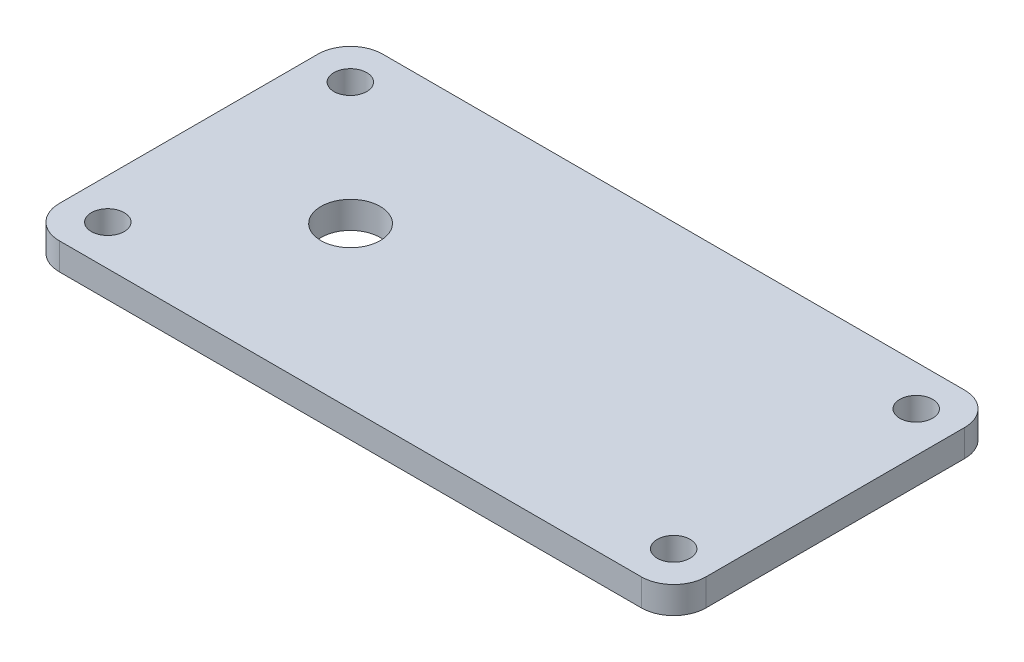
ISO-10303-21;
HEADER;
FILE_DESCRIPTION(('STEP AP214'),'2;1');
FILE_NAME('part.step','',(''),(''),'','','');
FILE_SCHEMA(('AUTOMOTIVE_DESIGN { 1 0 10303 214 1 1 1 1 }'));
ENDSEC;
DATA;
#1=APPLICATION_CONTEXT('core data for automotive mechanical design processes');
#2=APPLICATION_PROTOCOL_DEFINITION('international standard','automotive_design',2000,#1);
#3=PRODUCT_CONTEXT('',#1,'mechanical');
#4=PRODUCT('Part','Part','',(#3));
#5=PRODUCT_RELATED_PRODUCT_CATEGORY('part','',(#4));
#6=PRODUCT_DEFINITION_FORMATION('','',#4);
#7=PRODUCT_DEFINITION_CONTEXT('part definition',#1,'design');
#8=PRODUCT_DEFINITION('design','',#6,#7);
#9=PRODUCT_DEFINITION_SHAPE('','',#8);
#10=(LENGTH_UNIT() NAMED_UNIT(*) SI_UNIT(.MILLI.,.METRE.));
#11=(NAMED_UNIT(*) PLANE_ANGLE_UNIT() SI_UNIT($,.RADIAN.));
#12=(NAMED_UNIT(*) SI_UNIT($,.STERADIAN.) SOLID_ANGLE_UNIT());
#13=UNCERTAINTY_MEASURE_WITH_UNIT(LENGTH_MEASURE(1.E-05),#10,'distance_accuracy_value','');
#14=(GEOMETRIC_REPRESENTATION_CONTEXT(3) GLOBAL_UNCERTAINTY_ASSIGNED_CONTEXT((#13)) GLOBAL_UNIT_ASSIGNED_CONTEXT((#10,
#11,#12)) REPRESENTATION_CONTEXT('',''));
#15=CARTESIAN_POINT('',(0.,0.,0.));
#16=DIRECTION('',(0.,0.,1.));
#17=DIRECTION('',(1.,0.,0.));
#18=AXIS2_PLACEMENT_3D('',#15,#16,#17);
#19=CARTESIAN_POINT('',(60.,5.,-30.));
#20=DIRECTION('',(-1.,0.,0.));
#21=DIRECTION('',(0.,0.,1.));
#22=AXIS2_PLACEMENT_3D('',#19,#20,#21);
#23=PLANE('',#22);
#24=DIRECTION('',(0.,0.,-1.));
#25=VECTOR('',#24,1.);
#26=CARTESIAN_POINT('',(60.,0.,-30.));
#27=LINE('',#26,#25);
#28=CARTESIAN_POINT('',(60.,0.,24.));
#29=VERTEX_POINT('',#28);
#30=CARTESIAN_POINT('',(60.,0.,-24.));
#31=VERTEX_POINT('',#30);
#32=EDGE_CURVE('E133',#29,#31,#27,.T.);
#33=ORIENTED_EDGE('',*,*,#32,.T.);
#34=DIRECTION('',(0.,-1.,0.));
#35=VECTOR('',#34,1.);
#36=CARTESIAN_POINT('',(60.,5.,-24.));
#37=LINE('',#36,#35);
#38=CARTESIAN_POINT('',(60.,5.,-24.));
#39=VERTEX_POINT('',#38);
#40=EDGE_CURVE('E160',#31,#39,#37,.F.);
#41=ORIENTED_EDGE('',*,*,#40,.T.);
#42=DIRECTION('',(0.,0.,-1.));
#43=VECTOR('',#42,1.);
#44=CARTESIAN_POINT('',(60.,5.,-30.));
#45=LINE('',#44,#43);
#46=CARTESIAN_POINT('',(60.,5.,24.));
#47=VERTEX_POINT('',#46);
#48=EDGE_CURVE('E132',#47,#39,#45,.T.);
#49=ORIENTED_EDGE('',*,*,#48,.F.);
#50=DIRECTION('',(0.,-1.,0.));
#51=VECTOR('',#50,1.);
#52=CARTESIAN_POINT('',(60.,5.,24.));
#53=LINE('',#52,#51);
#54=EDGE_CURVE('E152',#47,#29,#53,.T.);
#55=ORIENTED_EDGE('',*,*,#54,.T.);
#56=EDGE_LOOP('',(#33,#41,#49,#55));
#57=FACE_BOUND('',#56,.T.);
#58=ADVANCED_FACE('F39',(#57),#23,.F.);
#59=CARTESIAN_POINT('',(-60.,5.,-30.));
#60=DIRECTION('',(0.,0.,1.));
#61=DIRECTION('',(1.,0.,0.));
#62=AXIS2_PLACEMENT_3D('',#59,#60,#61);
#63=PLANE('',#62);
#64=DIRECTION('',(-1.,0.,0.));
#65=VECTOR('',#64,1.);
#66=CARTESIAN_POINT('',(-60.,0.,-30.));
#67=LINE('',#66,#65);
#68=CARTESIAN_POINT('',(54.,0.,-30.));
#69=VERTEX_POINT('',#68);
#70=CARTESIAN_POINT('',(-54.,0.,-30.));
#71=VERTEX_POINT('',#70);
#72=EDGE_CURVE('E128',#69,#71,#67,.T.);
#73=ORIENTED_EDGE('',*,*,#72,.T.);
#74=DIRECTION('',(0.,-1.,0.));
#75=VECTOR('',#74,1.);
#76=CARTESIAN_POINT('',(-54.,5.,-30.));
#77=LINE('',#76,#75);
#78=CARTESIAN_POINT('',(-54.,5.,-30.));
#79=VERTEX_POINT('',#78);
#80=EDGE_CURVE('E108',#71,#79,#77,.F.);
#81=ORIENTED_EDGE('',*,*,#80,.T.);
#82=DIRECTION('',(-1.,0.,0.));
#83=VECTOR('',#82,1.);
#84=CARTESIAN_POINT('',(-60.,5.,-30.));
#85=LINE('',#84,#83);
#86=CARTESIAN_POINT('',(54.,5.,-30.));
#87=VERTEX_POINT('',#86);
#88=EDGE_CURVE('E174',#87,#79,#85,.T.);
#89=ORIENTED_EDGE('',*,*,#88,.F.);
#90=DIRECTION('',(0.,-1.,0.));
#91=VECTOR('',#90,1.);
#92=CARTESIAN_POINT('',(54.,5.,-30.));
#93=LINE('',#92,#91);
#94=EDGE_CURVE('E111',#87,#69,#93,.T.);
#95=ORIENTED_EDGE('',*,*,#94,.T.);
#96=EDGE_LOOP('',(#73,#81,#89,#95));
#97=FACE_BOUND('',#96,.T.);
#98=ADVANCED_FACE('F237',(#97),#63,.F.);
#99=CARTESIAN_POINT('',(-60.,5.,-30.));
#100=DIRECTION('',(1.,0.,0.));
#101=DIRECTION('',(0.,0.,-1.));
#102=AXIS2_PLACEMENT_3D('',#99,#100,#101);
#103=PLANE('',#102);
#104=DIRECTION('',(0.,0.,1.));
#105=VECTOR('',#104,1.);
#106=CARTESIAN_POINT('',(-60.,5.,-30.));
#107=LINE('',#106,#105);
#108=CARTESIAN_POINT('',(-60.,5.,-24.));
#109=VERTEX_POINT('',#108);
#110=CARTESIAN_POINT('',(-60.,5.,24.));
#111=VERTEX_POINT('',#110);
#112=EDGE_CURVE('E123',#109,#111,#107,.T.);
#113=ORIENTED_EDGE('',*,*,#112,.F.);
#114=DIRECTION('',(0.,-1.,0.));
#115=VECTOR('',#114,1.);
#116=CARTESIAN_POINT('',(-60.,5.,-24.));
#117=LINE('',#116,#115);
#118=CARTESIAN_POINT('',(-60.,0.,-24.));
#119=VERTEX_POINT('',#118);
#120=EDGE_CURVE('E107',#109,#119,#117,.T.);
#121=ORIENTED_EDGE('',*,*,#120,.T.);
#122=DIRECTION('',(0.,0.,1.));
#123=VECTOR('',#122,1.);
#124=CARTESIAN_POINT('',(-60.,0.,-30.));
#125=LINE('',#124,#123);
#126=CARTESIAN_POINT('',(-60.,0.,24.));
#127=VERTEX_POINT('',#126);
#128=EDGE_CURVE('E122',#119,#127,#125,.T.);
#129=ORIENTED_EDGE('',*,*,#128,.T.);
#130=DIRECTION('',(0.,-1.,0.));
#131=VECTOR('',#130,1.);
#132=CARTESIAN_POINT('',(-60.,5.,24.));
#133=LINE('',#132,#131);
#134=EDGE_CURVE('E121',#127,#111,#133,.F.);
#135=ORIENTED_EDGE('',*,*,#134,.T.);
#136=EDGE_LOOP('',(#113,#121,#129,#135));
#137=FACE_BOUND('',#136,.T.);
#138=ADVANCED_FACE('F120',(#137),#103,.F.);
#139=CARTESIAN_POINT('',(-60.,5.,30.));
#140=DIRECTION('',(0.,0.,-1.));
#141=DIRECTION('',(-1.,0.,0.));
#142=AXIS2_PLACEMENT_3D('',#139,#140,#141);
#143=PLANE('',#142);
#144=DIRECTION('',(1.,0.,0.));
#145=VECTOR('',#144,1.);
#146=CARTESIAN_POINT('',(-60.,0.,30.));
#147=LINE('',#146,#145);
#148=CARTESIAN_POINT('',(-54.,0.,30.));
#149=VERTEX_POINT('',#148);
#150=CARTESIAN_POINT('',(54.,0.,30.));
#151=VERTEX_POINT('',#150);
#152=EDGE_CURVE('E129',#149,#151,#147,.T.);
#153=ORIENTED_EDGE('',*,*,#152,.T.);
#154=DIRECTION('',(0.,-1.,0.));
#155=VECTOR('',#154,1.);
#156=CARTESIAN_POINT('',(54.,5.,30.));
#157=LINE('',#156,#155);
#158=CARTESIAN_POINT('',(54.,5.,30.));
#159=VERTEX_POINT('',#158);
#160=EDGE_CURVE('E11',#151,#159,#157,.F.);
#161=ORIENTED_EDGE('',*,*,#160,.T.);
#162=DIRECTION('',(1.,0.,0.));
#163=VECTOR('',#162,1.);
#164=CARTESIAN_POINT('',(-60.,5.,30.));
#165=LINE('',#164,#163);
#166=CARTESIAN_POINT('',(-54.,5.,30.));
#167=VERTEX_POINT('',#166);
#168=EDGE_CURVE('E138',#167,#159,#165,.T.);
#169=ORIENTED_EDGE('',*,*,#168,.F.);
#170=DIRECTION('',(0.,-1.,0.));
#171=VECTOR('',#170,1.);
#172=CARTESIAN_POINT('',(-54.,5.,30.));
#173=LINE('',#172,#171);
#174=EDGE_CURVE('E50',#167,#149,#173,.T.);
#175=ORIENTED_EDGE('',*,*,#174,.T.);
#176=EDGE_LOOP('',(#153,#161,#169,#175));
#177=FACE_BOUND('',#176,.T.);
#178=ADVANCED_FACE('F159',(#177),#143,.F.);
#179=CARTESIAN_POINT('',(0.,5.,0.));
#180=DIRECTION('',(0.,1.,0.));
#181=DIRECTION('',(0.,0.,1.));
#182=AXIS2_PLACEMENT_3D('',#179,#180,#181);
#183=PLANE('',#182);
#184=CARTESIAN_POINT('',(-29.7498226901039,5.,0.203269064290601));
#185=DIRECTION('',(0.,1.,0.));
#186=DIRECTION('',(0.,0.,1.));
#187=AXIS2_PLACEMENT_3D('',#184,#185,#186);
#188=CIRCLE('',#187,5.5);
#189=CARTESIAN_POINT('',(-29.7498226901039,5.,5.7032690642906));
#190=VERTEX_POINT('',#189);
#191=EDGE_CURVE('E210',#190,#190,#188,.T.);
#192=ORIENTED_EDGE('',*,*,#191,.F.);
#193=EDGE_LOOP('',(#192));
#194=FACE_BOUND('',#193,.T.);
#195=CARTESIAN_POINT('',(52.5,5.,-22.5));
#196=DIRECTION('',(0.,-1.,0.));
#197=DIRECTION('',(0.,0.,1.));
#198=AXIS2_PLACEMENT_3D('',#195,#196,#197);
#199=CIRCLE('',#198,3.05);
#200=CARTESIAN_POINT('',(52.5,5.,-19.45));
#201=VERTEX_POINT('',#200);
#202=EDGE_CURVE('E203',#201,#201,#199,.T.);
#203=ORIENTED_EDGE('',*,*,#202,.T.);
#204=EDGE_LOOP('',(#203));
#205=FACE_BOUND('',#204,.T.);
#206=CARTESIAN_POINT('',(52.5,5.,22.5));
#207=DIRECTION('',(0.,1.,0.));
#208=DIRECTION('',(0.,0.,-1.));
#209=AXIS2_PLACEMENT_3D('',#206,#207,#208);
#210=CIRCLE('',#209,3.05);
#211=CARTESIAN_POINT('',(52.5,5.,19.45));
#212=VERTEX_POINT('',#211);
#213=EDGE_CURVE('E191',#212,#212,#210,.T.);
#214=ORIENTED_EDGE('',*,*,#213,.F.);
#215=EDGE_LOOP('',(#214));
#216=FACE_BOUND('',#215,.T.);
#217=CARTESIAN_POINT('',(-52.5,5.,22.5));
#218=DIRECTION('',(0.,-1.,0.));
#219=DIRECTION('',(0.,0.,-1.));
#220=AXIS2_PLACEMENT_3D('',#217,#218,#219);
#221=CIRCLE('',#220,3.05);
#222=CARTESIAN_POINT('',(-52.5,5.,19.45));
#223=VERTEX_POINT('',#222);
#224=EDGE_CURVE('E188',#223,#223,#221,.T.);
#225=ORIENTED_EDGE('',*,*,#224,.T.);
#226=EDGE_LOOP('',(#225));
#227=FACE_BOUND('',#226,.T.);
#228=CARTESIAN_POINT('',(-52.5,5.,-22.5));
#229=DIRECTION('',(0.,1.,0.));
#230=DIRECTION('',(0.,0.,1.));
#231=AXIS2_PLACEMENT_3D('',#228,#229,#230);
#232=CIRCLE('',#231,3.05);
#233=CARTESIAN_POINT('',(-52.5,5.,-19.45));
#234=VERTEX_POINT('',#233);
#235=EDGE_CURVE('E178',#234,#234,#232,.T.);
#236=ORIENTED_EDGE('',*,*,#235,.F.);
#237=EDGE_LOOP('',(#236));
#238=FACE_BOUND('',#237,.T.);
#239=ORIENTED_EDGE('',*,*,#88,.T.);
#240=CARTESIAN_POINT('',(-54.,5.,-24.));
#241=DIRECTION('',(0.,1.,0.));
#242=DIRECTION('',(0.,0.,1.));
#243=AXIS2_PLACEMENT_3D('',#240,#241,#242);
#244=CIRCLE('',#243,6.);
#245=EDGE_CURVE('E155',#79,#109,#244,.T.);
#246=ORIENTED_EDGE('',*,*,#245,.T.);
#247=ORIENTED_EDGE('',*,*,#112,.T.);
#248=CARTESIAN_POINT('',(-54.,5.,24.));
#249=DIRECTION('',(0.,1.,0.));
#250=DIRECTION('',(0.,0.,1.));
#251=AXIS2_PLACEMENT_3D('',#248,#249,#250);
#252=CIRCLE('',#251,6.);
#253=EDGE_CURVE('E56',#111,#167,#252,.T.);
#254=ORIENTED_EDGE('',*,*,#253,.T.);
#255=ORIENTED_EDGE('',*,*,#168,.T.);
#256=CARTESIAN_POINT('',(54.,5.,24.));
#257=DIRECTION('',(0.,1.,0.));
#258=DIRECTION('',(0.,0.,1.));
#259=AXIS2_PLACEMENT_3D('',#256,#257,#258);
#260=CIRCLE('',#259,6.);
#261=EDGE_CURVE('E146',#159,#47,#260,.T.);
#262=ORIENTED_EDGE('',*,*,#261,.T.);
#263=ORIENTED_EDGE('',*,*,#48,.T.);
#264=CARTESIAN_POINT('',(54.,5.,-24.));
#265=DIRECTION('',(0.,1.,0.));
#266=DIRECTION('',(0.,0.,1.));
#267=AXIS2_PLACEMENT_3D('',#264,#265,#266);
#268=CIRCLE('',#267,6.);
#269=EDGE_CURVE('E147',#39,#87,#268,.T.);
#270=ORIENTED_EDGE('',*,*,#269,.T.);
#271=EDGE_LOOP('',(#239,#246,#247,#254,#255,#262,#263,#270));
#272=FACE_BOUND('',#271,.T.);
#273=ADVANCED_FACE('F225',(#194,#205,#216,#227,#238,#272),#183,.T.);
#274=CARTESIAN_POINT('',(0.,0.,0.));
#275=DIRECTION('',(0.,1.,0.));
#276=DIRECTION('',(0.,0.,1.));
#277=AXIS2_PLACEMENT_3D('',#274,#275,#276);
#278=PLANE('',#277);
#279=CARTESIAN_POINT('',(-29.7498226901039,0.,0.203269064290601));
#280=DIRECTION('',(0.,1.,0.));
#281=DIRECTION('',(0.,0.,1.));
#282=AXIS2_PLACEMENT_3D('',#279,#280,#281);
#283=CIRCLE('',#282,5.5);
#284=CARTESIAN_POINT('',(-29.7498226901039,0.,5.7032690642906));
#285=VERTEX_POINT('',#284);
#286=EDGE_CURVE('E204',#285,#285,#283,.T.);
#287=ORIENTED_EDGE('',*,*,#286,.T.);
#288=EDGE_LOOP('',(#287));
#289=FACE_BOUND('',#288,.T.);
#290=CARTESIAN_POINT('',(52.5,0.,-22.5));
#291=DIRECTION('',(0.,-1.,0.));
#292=DIRECTION('',(0.,0.,1.));
#293=AXIS2_PLACEMENT_3D('',#290,#291,#292);
#294=CIRCLE('',#293,3.05);
#295=CARTESIAN_POINT('',(52.5,0.,-19.45));
#296=VERTEX_POINT('',#295);
#297=EDGE_CURVE('E196',#296,#296,#294,.T.);
#298=ORIENTED_EDGE('',*,*,#297,.F.);
#299=EDGE_LOOP('',(#298));
#300=FACE_BOUND('',#299,.T.);
#301=CARTESIAN_POINT('',(52.5,0.,22.5));
#302=DIRECTION('',(0.,1.,0.));
#303=DIRECTION('',(0.,0.,-1.));
#304=AXIS2_PLACEMENT_3D('',#301,#302,#303);
#305=CIRCLE('',#304,3.05);
#306=CARTESIAN_POINT('',(52.5,0.,19.45));
#307=VERTEX_POINT('',#306);
#308=EDGE_CURVE('E195',#307,#307,#305,.T.);
#309=ORIENTED_EDGE('',*,*,#308,.T.);
#310=EDGE_LOOP('',(#309));
#311=FACE_BOUND('',#310,.T.);
#312=CARTESIAN_POINT('',(-52.5,0.,22.5));
#313=DIRECTION('',(0.,-1.,0.));
#314=DIRECTION('',(0.,0.,-1.));
#315=AXIS2_PLACEMENT_3D('',#312,#313,#314);
#316=CIRCLE('',#315,3.05);
#317=CARTESIAN_POINT('',(-52.5,0.,19.45));
#318=VERTEX_POINT('',#317);
#319=EDGE_CURVE('E187',#318,#318,#316,.T.);
#320=ORIENTED_EDGE('',*,*,#319,.F.);
#321=EDGE_LOOP('',(#320));
#322=FACE_BOUND('',#321,.T.);
#323=CARTESIAN_POINT('',(-52.5,0.,-22.5));
#324=DIRECTION('',(0.,1.,0.));
#325=DIRECTION('',(0.,0.,1.));
#326=AXIS2_PLACEMENT_3D('',#323,#324,#325);
#327=CIRCLE('',#326,3.05);
#328=CARTESIAN_POINT('',(-52.5,0.,-19.45));
#329=VERTEX_POINT('',#328);
#330=EDGE_CURVE('E185',#329,#329,#327,.T.);
#331=ORIENTED_EDGE('',*,*,#330,.T.);
#332=EDGE_LOOP('',(#331));
#333=FACE_BOUND('',#332,.T.);
#334=ORIENTED_EDGE('',*,*,#128,.F.);
#335=CARTESIAN_POINT('',(-54.,0.,-24.));
#336=DIRECTION('',(0.,1.,0.));
#337=DIRECTION('',(0.,0.,1.));
#338=AXIS2_PLACEMENT_3D('',#335,#336,#337);
#339=CIRCLE('',#338,6.);
#340=EDGE_CURVE('E102',#119,#71,#339,.F.);
#341=ORIENTED_EDGE('',*,*,#340,.T.);
#342=ORIENTED_EDGE('',*,*,#72,.F.);
#343=CARTESIAN_POINT('',(54.,0.,-24.));
#344=DIRECTION('',(0.,1.,0.));
#345=DIRECTION('',(0.,0.,1.));
#346=AXIS2_PLACEMENT_3D('',#343,#344,#345);
#347=CIRCLE('',#346,6.);
#348=EDGE_CURVE('E113',#69,#31,#347,.F.);
#349=ORIENTED_EDGE('',*,*,#348,.T.);
#350=ORIENTED_EDGE('',*,*,#32,.F.);
#351=CARTESIAN_POINT('',(54.,0.,24.));
#352=DIRECTION('',(0.,1.,0.));
#353=DIRECTION('',(0.,0.,1.));
#354=AXIS2_PLACEMENT_3D('',#351,#352,#353);
#355=CIRCLE('',#354,6.);
#356=EDGE_CURVE('E143',#29,#151,#355,.F.);
#357=ORIENTED_EDGE('',*,*,#356,.T.);
#358=ORIENTED_EDGE('',*,*,#152,.F.);
#359=CARTESIAN_POINT('',(-54.,0.,24.));
#360=DIRECTION('',(0.,1.,0.));
#361=DIRECTION('',(0.,0.,1.));
#362=AXIS2_PLACEMENT_3D('',#359,#360,#361);
#363=CIRCLE('',#362,6.);
#364=EDGE_CURVE('E124',#149,#127,#363,.F.);
#365=ORIENTED_EDGE('',*,*,#364,.T.);
#366=EDGE_LOOP('',(#334,#341,#342,#349,#350,#357,#358,#365));
#367=FACE_BOUND('',#366,.T.);
#368=ADVANCED_FACE('F130',(#289,#300,#311,#322,#333,#367),#278,.F.);
#369=CARTESIAN_POINT('',(-52.5,0.,-22.5));
#370=DIRECTION('',(0.,1.,0.));
#371=DIRECTION('',(0.,0.,1.));
#372=AXIS2_PLACEMENT_3D('',#369,#370,#371);
#373=CYLINDRICAL_SURFACE('',#372,3.05);
#374=ORIENTED_EDGE('',*,*,#330,.F.);
#375=EDGE_LOOP('',(#374));
#376=FACE_BOUND('',#375,.T.);
#377=ORIENTED_EDGE('',*,*,#235,.T.);
#378=EDGE_LOOP('',(#377));
#379=FACE_BOUND('',#378,.T.);
#380=ADVANCED_FACE('F256',(#376,#379),#373,.F.);
#381=CARTESIAN_POINT('',(-52.5,0.,22.5));
#382=DIRECTION('',(0.,1.,0.));
#383=DIRECTION('',(0.,0.,1.));
#384=AXIS2_PLACEMENT_3D('',#381,#382,#383);
#385=CYLINDRICAL_SURFACE('',#384,3.05);
#386=ORIENTED_EDGE('',*,*,#319,.T.);
#387=EDGE_LOOP('',(#386));
#388=FACE_BOUND('',#387,.T.);
#389=ORIENTED_EDGE('',*,*,#224,.F.);
#390=EDGE_LOOP('',(#389));
#391=FACE_BOUND('',#390,.T.);
#392=ADVANCED_FACE('F265',(#388,#391),#385,.F.);
#393=CARTESIAN_POINT('',(52.5,0.,22.5));
#394=DIRECTION('',(0.,1.,0.));
#395=DIRECTION('',(0.,0.,1.));
#396=AXIS2_PLACEMENT_3D('',#393,#394,#395);
#397=CYLINDRICAL_SURFACE('',#396,3.05);
#398=ORIENTED_EDGE('',*,*,#308,.F.);
#399=EDGE_LOOP('',(#398));
#400=FACE_BOUND('',#399,.T.);
#401=ORIENTED_EDGE('',*,*,#213,.T.);
#402=EDGE_LOOP('',(#401));
#403=FACE_BOUND('',#402,.T.);
#404=ADVANCED_FACE('F266',(#400,#403),#397,.F.);
#405=CARTESIAN_POINT('',(52.5,0.,-22.5));
#406=DIRECTION('',(0.,1.,0.));
#407=DIRECTION('',(0.,0.,1.));
#408=AXIS2_PLACEMENT_3D('',#405,#406,#407);
#409=CYLINDRICAL_SURFACE('',#408,3.05);
#410=ORIENTED_EDGE('',*,*,#297,.T.);
#411=EDGE_LOOP('',(#410));
#412=FACE_BOUND('',#411,.T.);
#413=ORIENTED_EDGE('',*,*,#202,.F.);
#414=EDGE_LOOP('',(#413));
#415=FACE_BOUND('',#414,.T.);
#416=ADVANCED_FACE('F217',(#412,#415),#409,.F.);
#417=CARTESIAN_POINT('',(-29.7498226901039,0.,0.203269064290601));
#418=DIRECTION('',(0.,1.,0.));
#419=DIRECTION('',(0.,0.,1.));
#420=AXIS2_PLACEMENT_3D('',#417,#418,#419);
#421=CYLINDRICAL_SURFACE('',#420,5.5);
#422=ORIENTED_EDGE('',*,*,#286,.F.);
#423=EDGE_LOOP('',(#422));
#424=FACE_BOUND('',#423,.T.);
#425=ORIENTED_EDGE('',*,*,#191,.T.);
#426=EDGE_LOOP('',(#425));
#427=FACE_BOUND('',#426,.T.);
#428=ADVANCED_FACE('F214',(#424,#427),#421,.F.);
#429=CARTESIAN_POINT('',(-54.,5.,-24.));
#430=DIRECTION('',(0.,-1.,0.));
#431=DIRECTION('',(0.,0.,-1.));
#432=AXIS2_PLACEMENT_3D('',#429,#430,#431);
#433=CYLINDRICAL_SURFACE('',#432,6.);
#434=ORIENTED_EDGE('',*,*,#245,.F.);
#435=ORIENTED_EDGE('',*,*,#80,.F.);
#436=ORIENTED_EDGE('',*,*,#340,.F.);
#437=ORIENTED_EDGE('',*,*,#120,.F.);
#438=EDGE_LOOP('',(#434,#435,#436,#437));
#439=FACE_BOUND('',#438,.T.);
#440=ADVANCED_FACE('F110',(#439),#433,.T.);
#441=CARTESIAN_POINT('',(54.,5.,-24.));
#442=DIRECTION('',(0.,-1.,0.));
#443=DIRECTION('',(0.,0.,-1.));
#444=AXIS2_PLACEMENT_3D('',#441,#442,#443);
#445=CYLINDRICAL_SURFACE('',#444,6.);
#446=ORIENTED_EDGE('',*,*,#269,.F.);
#447=ORIENTED_EDGE('',*,*,#40,.F.);
#448=ORIENTED_EDGE('',*,*,#348,.F.);
#449=ORIENTED_EDGE('',*,*,#94,.F.);
#450=EDGE_LOOP('',(#446,#447,#448,#449));
#451=FACE_BOUND('',#450,.T.);
#452=ADVANCED_FACE('F236',(#451),#445,.T.);
#453=CARTESIAN_POINT('',(54.,5.,24.));
#454=DIRECTION('',(0.,-1.,0.));
#455=DIRECTION('',(0.,0.,-1.));
#456=AXIS2_PLACEMENT_3D('',#453,#454,#455);
#457=CYLINDRICAL_SURFACE('',#456,6.);
#458=ORIENTED_EDGE('',*,*,#261,.F.);
#459=ORIENTED_EDGE('',*,*,#160,.F.);
#460=ORIENTED_EDGE('',*,*,#356,.F.);
#461=ORIENTED_EDGE('',*,*,#54,.F.);
#462=EDGE_LOOP('',(#458,#459,#460,#461));
#463=FACE_BOUND('',#462,.T.);
#464=ADVANCED_FACE('F170',(#463),#457,.T.);
#465=CARTESIAN_POINT('',(-54.,5.,24.));
#466=DIRECTION('',(0.,-1.,0.));
#467=DIRECTION('',(0.,0.,-1.));
#468=AXIS2_PLACEMENT_3D('',#465,#466,#467);
#469=CYLINDRICAL_SURFACE('',#468,6.);
#470=ORIENTED_EDGE('',*,*,#253,.F.);
#471=ORIENTED_EDGE('',*,*,#134,.F.);
#472=ORIENTED_EDGE('',*,*,#364,.F.);
#473=ORIENTED_EDGE('',*,*,#174,.F.);
#474=EDGE_LOOP('',(#470,#471,#472,#473));
#475=FACE_BOUND('',#474,.T.);
#476=ADVANCED_FACE('F41',(#475),#469,.T.);
#477=CLOSED_SHELL('',(#58,#98,#138,#178,#273,#368,#380,#392,#404,#416,#428,#440,#452,#464,#476));
#478=MANIFOLD_SOLID_BREP('B2',#477);
#479=ADVANCED_BREP_SHAPE_REPRESENTATION('',(#18,#478),#14);
#480=SHAPE_DEFINITION_REPRESENTATION(#9,#479);
ENDSEC;
END-ISO-10303-21;
